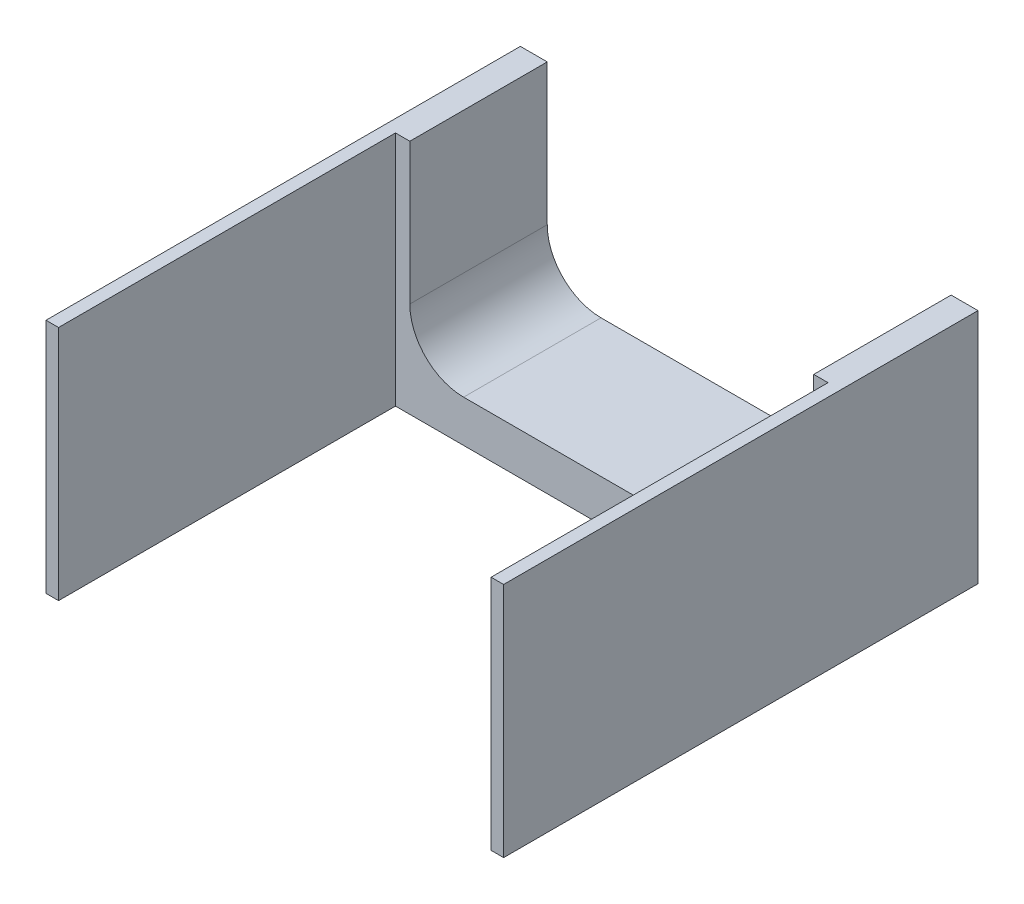
ISO-10303-21;
HEADER;
FILE_DESCRIPTION(('STEP AP214'),'2;1');
FILE_NAME('part.step','',(''),(''),'','','');
FILE_SCHEMA(('AUTOMOTIVE_DESIGN { 1 0 10303 214 1 1 1 1 }'));
ENDSEC;
DATA;
#1=APPLICATION_CONTEXT('core data for automotive mechanical design processes');
#2=APPLICATION_PROTOCOL_DEFINITION('international standard','automotive_design',2000,#1);
#3=PRODUCT_CONTEXT('',#1,'mechanical');
#4=PRODUCT('Part','Part','',(#3));
#5=PRODUCT_RELATED_PRODUCT_CATEGORY('part','',(#4));
#6=PRODUCT_DEFINITION_FORMATION('','',#4);
#7=PRODUCT_DEFINITION_CONTEXT('part definition',#1,'design');
#8=PRODUCT_DEFINITION('design','',#6,#7);
#9=PRODUCT_DEFINITION_SHAPE('','',#8);
#10=(LENGTH_UNIT() NAMED_UNIT(*) SI_UNIT(.MILLI.,.METRE.));
#11=(NAMED_UNIT(*) PLANE_ANGLE_UNIT() SI_UNIT($,.RADIAN.));
#12=(NAMED_UNIT(*) SI_UNIT($,.STERADIAN.) SOLID_ANGLE_UNIT());
#13=UNCERTAINTY_MEASURE_WITH_UNIT(LENGTH_MEASURE(1.E-05),#10,'distance_accuracy_value','');
#14=(GEOMETRIC_REPRESENTATION_CONTEXT(3) GLOBAL_UNCERTAINTY_ASSIGNED_CONTEXT((#13)) GLOBAL_UNIT_ASSIGNED_CONTEXT((#10,
#11,#12)) REPRESENTATION_CONTEXT('',''));
#15=CARTESIAN_POINT('',(0.,0.,0.));
#16=DIRECTION('',(0.,0.,1.));
#17=DIRECTION('',(1.,0.,0.));
#18=AXIS2_PLACEMENT_3D('',#15,#16,#17);
#19=CARTESIAN_POINT('',(18.1,-16.25,39.7));
#20=DIRECTION('',(0.,-1.,0.));
#21=DIRECTION('',(1.,0.,0.));
#22=AXIS2_PLACEMENT_3D('',#19,#20,#21);
#23=PLANE('',#22);
#24=DIRECTION('',(-1.,0.,0.));
#25=VECTOR('',#24,1.);
#26=CARTESIAN_POINT('',(0.,-16.25,39.7));
#27=LINE('',#26,#25);
#28=CARTESIAN_POINT('',(-18.1,-16.25,39.7));
#29=VERTEX_POINT('',#28);
#30=CARTESIAN_POINT('',(-19.15,-16.25,39.7));
#31=VERTEX_POINT('',#30);
#32=EDGE_CURVE('E194',#29,#31,#27,.T.);
#33=ORIENTED_EDGE('',*,*,#32,.T.);
#34=DIRECTION('',(0.,0.,-1.));
#35=VECTOR('',#34,1.);
#36=CARTESIAN_POINT('',(-19.15,-16.25,39.7));
#37=LINE('',#36,#35);
#38=CARTESIAN_POINT('',(-19.15,-16.25,0.));
#39=VERTEX_POINT('',#38);
#40=EDGE_CURVE('E62',#31,#39,#37,.T.);
#41=ORIENTED_EDGE('',*,*,#40,.T.);
#42=DIRECTION('',(-1.,0.,0.));
#43=VECTOR('',#42,1.);
#44=CARTESIAN_POINT('',(-22.25,-16.25,0.));
#45=LINE('',#44,#43);
#46=CARTESIAN_POINT('',(19.15,-16.25,0.));
#47=VERTEX_POINT('',#46);
#48=EDGE_CURVE('E190',#47,#39,#45,.T.);
#49=ORIENTED_EDGE('',*,*,#48,.F.);
#50=DIRECTION('',(0.,0.,-1.));
#51=VECTOR('',#50,1.);
#52=CARTESIAN_POINT('',(19.15,-16.25,39.7));
#53=LINE('',#52,#51);
#54=CARTESIAN_POINT('',(19.15,-16.25,39.7));
#55=VERTEX_POINT('',#54);
#56=EDGE_CURVE('E159',#55,#47,#53,.T.);
#57=ORIENTED_EDGE('',*,*,#56,.F.);
#58=CARTESIAN_POINT('',(18.1,-16.25,39.7));
#59=VERTEX_POINT('',#58);
#60=EDGE_CURVE('E163',#55,#59,#27,.T.);
#61=ORIENTED_EDGE('',*,*,#60,.T.);
#62=DIRECTION('',(0.,0.,-1.));
#63=VECTOR('',#62,1.);
#64=CARTESIAN_POINT('',(18.1,-16.25,39.7));
#65=LINE('',#64,#63);
#66=CARTESIAN_POINT('',(18.1,-16.25,11.5));
#67=VERTEX_POINT('',#66);
#68=EDGE_CURVE('E203',#59,#67,#65,.T.);
#69=ORIENTED_EDGE('',*,*,#68,.T.);
#70=DIRECTION('',(-1.,0.,0.));
#71=VECTOR('',#70,1.);
#72=CARTESIAN_POINT('',(18.1,-16.25,11.5));
#73=LINE('',#72,#71);
#74=CARTESIAN_POINT('',(-18.1,-16.25,11.5));
#75=VERTEX_POINT('',#74);
#76=EDGE_CURVE('E206',#67,#75,#73,.T.);
#77=ORIENTED_EDGE('',*,*,#76,.T.);
#78=DIRECTION('',(0.,0.,-1.));
#79=VECTOR('',#78,1.);
#80=CARTESIAN_POINT('',(-18.1,-16.25,39.7));
#81=LINE('',#80,#79);
#82=EDGE_CURVE('E210',#29,#75,#81,.T.);
#83=ORIENTED_EDGE('',*,*,#82,.F.);
#84=EDGE_LOOP('',(#33,#41,#49,#57,#61,#69,#77,#83));
#85=FACE_BOUND('',#84,.T.);
#86=ADVANCED_FACE('F40',(#85),#23,.T.);
#87=CARTESIAN_POINT('',(0.,0.,39.7));
#88=DIRECTION('',(0.,0.,-1.));
#89=DIRECTION('',(-1.,0.,0.));
#90=AXIS2_PLACEMENT_3D('',#87,#88,#89);
#91=PLANE('',#90);
#92=DIRECTION('',(0.,-1.,0.));
#93=VECTOR('',#92,1.);
#94=CARTESIAN_POINT('',(19.15,3.55000000000002,39.7));
#95=LINE('',#94,#93);
#96=CARTESIAN_POINT('',(19.15,3.55000000000002,39.7));
#97=VERTEX_POINT('',#96);
#98=EDGE_CURVE('E150',#97,#55,#95,.T.);
#99=ORIENTED_EDGE('',*,*,#98,.F.);
#100=DIRECTION('',(1.,0.,0.));
#101=VECTOR('',#100,1.);
#102=CARTESIAN_POINT('',(16.9,3.55000000000002,39.7));
#103=LINE('',#102,#101);
#104=CARTESIAN_POINT('',(18.1,3.55000000000002,39.7));
#105=VERTEX_POINT('',#104);
#106=EDGE_CURVE('E139',#105,#97,#103,.T.);
#107=ORIENTED_EDGE('',*,*,#106,.F.);
#108=DIRECTION('',(0.,-1.,0.));
#109=VECTOR('',#108,1.);
#110=CARTESIAN_POINT('',(18.1,16.25,39.7));
#111=LINE('',#110,#109);
#112=EDGE_CURVE('E197',#105,#59,#111,.T.);
#113=ORIENTED_EDGE('',*,*,#112,.T.);
#114=ORIENTED_EDGE('',*,*,#60,.F.);
#115=EDGE_LOOP('',(#99,#107,#113,#114));
#116=FACE_BOUND('',#115,.T.);
#117=ADVANCED_FACE('F162',(#116),#91,.F.);
#118=CARTESIAN_POINT('',(16.9,-12.75,11.5));
#119=DIRECTION('',(-1.,0.,0.));
#120=DIRECTION('',(0.,0.,1.));
#121=AXIS2_PLACEMENT_3D('',#118,#119,#120);
#122=PLANE('',#121);
#123=DIRECTION('',(0.,1.,0.));
#124=VECTOR('',#123,1.);
#125=CARTESIAN_POINT('',(16.9,-12.75,11.5));
#126=LINE('',#125,#124);
#127=CARTESIAN_POINT('',(16.9,-8.24999999999999,11.5));
#128=VERTEX_POINT('',#127);
#129=CARTESIAN_POINT('',(16.9,3.55000000000002,11.5));
#130=VERTEX_POINT('',#129);
#131=EDGE_CURVE('E222',#128,#130,#126,.T.);
#132=ORIENTED_EDGE('',*,*,#131,.T.);
#133=DIRECTION('',(0.,0.,-1.));
#134=VECTOR('',#133,1.);
#135=CARTESIAN_POINT('',(16.9,3.55000000000002,39.7));
#136=LINE('',#135,#134);
#137=CARTESIAN_POINT('',(16.9,3.55000000000002,0.));
#138=VERTEX_POINT('',#137);
#139=EDGE_CURVE('E54',#130,#138,#136,.T.);
#140=ORIENTED_EDGE('',*,*,#139,.T.);
#141=DIRECTION('',(0.,1.,0.));
#142=VECTOR('',#141,1.);
#143=CARTESIAN_POINT('',(16.9,-12.75,0.));
#144=LINE('',#143,#142);
#145=CARTESIAN_POINT('',(16.9,-8.24999999999999,0.));
#146=VERTEX_POINT('',#145);
#147=EDGE_CURVE('E219',#146,#138,#144,.T.);
#148=ORIENTED_EDGE('',*,*,#147,.F.);
#149=DIRECTION('',(0.,0.,-1.));
#150=VECTOR('',#149,1.);
#151=CARTESIAN_POINT('',(16.9,-8.24999999999999,11.5));
#152=LINE('',#151,#150);
#153=EDGE_CURVE('E225',#146,#128,#152,.F.);
#154=ORIENTED_EDGE('',*,*,#153,.T.);
#155=EDGE_LOOP('',(#132,#140,#148,#154));
#156=FACE_BOUND('',#155,.T.);
#157=ADVANCED_FACE('F298',(#156),#122,.T.);
#158=CARTESIAN_POINT('',(-16.9,-12.75,11.5));
#159=DIRECTION('',(1.,0.,0.));
#160=DIRECTION('',(0.,0.,-1.));
#161=AXIS2_PLACEMENT_3D('',#158,#159,#160);
#162=PLANE('',#161);
#163=DIRECTION('',(0.,-1.,0.));
#164=VECTOR('',#163,1.);
#165=CARTESIAN_POINT('',(-16.9,-12.75,0.));
#166=LINE('',#165,#164);
#167=CARTESIAN_POINT('',(-16.9,3.55000000000002,0.));
#168=VERTEX_POINT('',#167);
#169=CARTESIAN_POINT('',(-16.9,-8.24999999999999,0.));
#170=VERTEX_POINT('',#169);
#171=EDGE_CURVE('E213',#168,#170,#166,.T.);
#172=ORIENTED_EDGE('',*,*,#171,.F.);
#173=DIRECTION('',(0.,0.,-1.));
#174=VECTOR('',#173,1.);
#175=CARTESIAN_POINT('',(-16.9,3.55000000000002,39.7));
#176=LINE('',#175,#174);
#177=CARTESIAN_POINT('',(-16.9,3.55000000000002,11.5));
#178=VERTEX_POINT('',#177);
#179=EDGE_CURVE('E178',#178,#168,#176,.T.);
#180=ORIENTED_EDGE('',*,*,#179,.F.);
#181=DIRECTION('',(0.,-1.,0.));
#182=VECTOR('',#181,1.);
#183=CARTESIAN_POINT('',(-16.9,-12.75,11.5));
#184=LINE('',#183,#182);
#185=CARTESIAN_POINT('',(-16.9,-8.24999999999999,11.5));
#186=VERTEX_POINT('',#185);
#187=EDGE_CURVE('E216',#178,#186,#184,.T.);
#188=ORIENTED_EDGE('',*,*,#187,.T.);
#189=DIRECTION('',(0.,0.,-1.));
#190=VECTOR('',#189,1.);
#191=CARTESIAN_POINT('',(-16.9,-8.24999999999999,0.));
#192=LINE('',#191,#190);
#193=EDGE_CURVE('E233',#186,#170,#192,.T.);
#194=ORIENTED_EDGE('',*,*,#193,.T.);
#195=EDGE_LOOP('',(#172,#180,#188,#194));
#196=FACE_BOUND('',#195,.T.);
#197=ADVANCED_FACE('F259',(#196),#162,.T.);
#198=CARTESIAN_POINT('',(0.,0.,0.));
#199=DIRECTION('',(0.,0.,-1.));
#200=DIRECTION('',(-1.,0.,0.));
#201=AXIS2_PLACEMENT_3D('',#198,#199,#200);
#202=PLANE('',#201);
#203=DIRECTION('',(0.,1.,0.));
#204=VECTOR('',#203,1.);
#205=CARTESIAN_POINT('',(-19.15,-16.25,0.));
#206=LINE('',#205,#204);
#207=CARTESIAN_POINT('',(-19.15,3.55000000000002,0.));
#208=VERTEX_POINT('',#207);
#209=EDGE_CURVE('E173',#39,#208,#206,.T.);
#210=ORIENTED_EDGE('',*,*,#209,.T.);
#211=DIRECTION('',(1.,0.,0.));
#212=VECTOR('',#211,1.);
#213=CARTESIAN_POINT('',(-19.15,3.55000000000002,0.));
#214=LINE('',#213,#212);
#215=EDGE_CURVE('E151',#208,#168,#214,.T.);
#216=ORIENTED_EDGE('',*,*,#215,.T.);
#217=ORIENTED_EDGE('',*,*,#171,.T.);
#218=CARTESIAN_POINT('',(-12.4,-8.24999999999999,0.));
#219=DIRECTION('',(0.,0.,-1.));
#220=DIRECTION('',(-1.,0.,0.));
#221=AXIS2_PLACEMENT_3D('',#218,#219,#220);
#222=CIRCLE('',#221,4.5);
#223=CARTESIAN_POINT('',(-12.4,-12.75,0.));
#224=VERTEX_POINT('',#223);
#225=EDGE_CURVE('E245',#170,#224,#222,.F.);
#226=ORIENTED_EDGE('',*,*,#225,.T.);
#227=DIRECTION('',(1.,0.,0.));
#228=VECTOR('',#227,1.);
#229=CARTESIAN_POINT('',(-16.9,-12.75,0.));
#230=LINE('',#229,#228);
#231=CARTESIAN_POINT('',(12.4,-12.75,0.));
#232=VERTEX_POINT('',#231);
#233=EDGE_CURVE('E227',#224,#232,#230,.T.);
#234=ORIENTED_EDGE('',*,*,#233,.T.);
#235=CARTESIAN_POINT('',(12.4,-8.24999999999999,0.));
#236=DIRECTION('',(0.,0.,-1.));
#237=DIRECTION('',(-1.,0.,0.));
#238=AXIS2_PLACEMENT_3D('',#235,#236,#237);
#239=CIRCLE('',#238,4.5);
#240=EDGE_CURVE('E241',#232,#146,#239,.F.);
#241=ORIENTED_EDGE('',*,*,#240,.T.);
#242=ORIENTED_EDGE('',*,*,#147,.T.);
#243=DIRECTION('',(1.,0.,0.));
#244=VECTOR('',#243,1.);
#245=CARTESIAN_POINT('',(16.9,3.55000000000002,0.));
#246=LINE('',#245,#244);
#247=CARTESIAN_POINT('',(19.15,3.55000000000002,0.));
#248=VERTEX_POINT('',#247);
#249=EDGE_CURVE('E170',#138,#248,#246,.T.);
#250=ORIENTED_EDGE('',*,*,#249,.T.);
#251=DIRECTION('',(0.,-1.,0.));
#252=VECTOR('',#251,1.);
#253=CARTESIAN_POINT('',(19.15,3.55000000000002,0.));
#254=LINE('',#253,#252);
#255=EDGE_CURVE('E157',#248,#47,#254,.T.);
#256=ORIENTED_EDGE('',*,*,#255,.T.);
#257=ORIENTED_EDGE('',*,*,#48,.T.);
#258=EDGE_LOOP('',(#210,#216,#217,#226,#234,#241,#242,#250,#256,#257));
#259=FACE_BOUND('',#258,.T.);
#260=ADVANCED_FACE('F265',(#259),#202,.T.);
#261=CARTESIAN_POINT('',(18.1,16.25,39.7));
#262=DIRECTION('',(1.,0.,0.));
#263=DIRECTION('',(0.,1.,0.));
#264=AXIS2_PLACEMENT_3D('',#261,#262,#263);
#265=PLANE('',#264);
#266=DIRECTION('',(0.,0.,1.));
#267=VECTOR('',#266,1.);
#268=CARTESIAN_POINT('',(18.1,3.55000000000002,39.7));
#269=LINE('',#268,#267);
#270=CARTESIAN_POINT('',(18.1,3.55000000000002,11.5));
#271=VERTEX_POINT('',#270);
#272=EDGE_CURVE('E145',#271,#105,#269,.T.);
#273=ORIENTED_EDGE('',*,*,#272,.F.);
#274=DIRECTION('',(0.,-1.,0.));
#275=VECTOR('',#274,1.);
#276=CARTESIAN_POINT('',(18.1,16.25,11.5));
#277=LINE('',#276,#275);
#278=EDGE_CURVE('E204',#271,#67,#277,.T.);
#279=ORIENTED_EDGE('',*,*,#278,.T.);
#280=ORIENTED_EDGE('',*,*,#68,.F.);
#281=ORIENTED_EDGE('',*,*,#112,.F.);
#282=EDGE_LOOP('',(#273,#279,#280,#281));
#283=FACE_BOUND('',#282,.T.);
#284=ADVANCED_FACE('F282',(#283),#265,.F.);
#285=CARTESIAN_POINT('',(0.,0.,11.5));
#286=DIRECTION('',(0.,0.,-1.));
#287=DIRECTION('',(-1.,0.,0.));
#288=AXIS2_PLACEMENT_3D('',#285,#286,#287);
#289=PLANE('',#288);
#290=DIRECTION('',(1.,0.,0.));
#291=VECTOR('',#290,1.);
#292=CARTESIAN_POINT('',(0.,3.55000000000002,11.5));
#293=LINE('',#292,#291);
#294=CARTESIAN_POINT('',(-18.1,3.55000000000002,11.5));
#295=VERTEX_POINT('',#294);
#296=EDGE_CURVE('E187',#295,#178,#293,.T.);
#297=ORIENTED_EDGE('',*,*,#296,.F.);
#298=DIRECTION('',(0.,1.,0.));
#299=VECTOR('',#298,1.);
#300=CARTESIAN_POINT('',(-18.1,16.25,11.5));
#301=LINE('',#300,#299);
#302=EDGE_CURVE('E200',#75,#295,#301,.T.);
#303=ORIENTED_EDGE('',*,*,#302,.F.);
#304=ORIENTED_EDGE('',*,*,#76,.F.);
#305=ORIENTED_EDGE('',*,*,#278,.F.);
#306=DIRECTION('',(1.,0.,0.));
#307=VECTOR('',#306,1.);
#308=CARTESIAN_POINT('',(0.,3.55000000000002,11.5));
#309=LINE('',#308,#307);
#310=EDGE_CURVE('E13',#130,#271,#309,.T.);
#311=ORIENTED_EDGE('',*,*,#310,.F.);
#312=ORIENTED_EDGE('',*,*,#131,.F.);
#313=CARTESIAN_POINT('',(12.4,-8.24999999999999,11.5));
#314=DIRECTION('',(0.,0.,-1.));
#315=DIRECTION('',(-1.,0.,0.));
#316=AXIS2_PLACEMENT_3D('',#313,#314,#315);
#317=CIRCLE('',#316,4.5);
#318=CARTESIAN_POINT('',(12.4,-12.75,11.5));
#319=VERTEX_POINT('',#318);
#320=EDGE_CURVE('E243',#128,#319,#317,.T.);
#321=ORIENTED_EDGE('',*,*,#320,.T.);
#322=DIRECTION('',(1.,0.,0.));
#323=VECTOR('',#322,1.);
#324=CARTESIAN_POINT('',(-16.9,-12.75,11.5));
#325=LINE('',#324,#323);
#326=CARTESIAN_POINT('',(-12.4,-12.75,11.5));
#327=VERTEX_POINT('',#326);
#328=EDGE_CURVE('E218',#327,#319,#325,.T.);
#329=ORIENTED_EDGE('',*,*,#328,.F.);
#330=CARTESIAN_POINT('',(-12.4,-8.24999999999999,11.5));
#331=DIRECTION('',(0.,0.,-1.));
#332=DIRECTION('',(-1.,0.,0.));
#333=AXIS2_PLACEMENT_3D('',#330,#331,#332);
#334=CIRCLE('',#333,4.5);
#335=EDGE_CURVE('E48',#327,#186,#334,.T.);
#336=ORIENTED_EDGE('',*,*,#335,.T.);
#337=ORIENTED_EDGE('',*,*,#187,.F.);
#338=EDGE_LOOP('',(#297,#303,#304,#305,#311,#312,#321,#329,#336,#337));
#339=FACE_BOUND('',#338,.T.);
#340=ADVANCED_FACE('F253',(#339),#289,.F.);
#341=CARTESIAN_POINT('',(-18.1,16.25,39.7));
#342=DIRECTION('',(-1.,0.,0.));
#343=DIRECTION('',(0.,-1.,0.));
#344=AXIS2_PLACEMENT_3D('',#341,#342,#343);
#345=PLANE('',#344);
#346=DIRECTION('',(0.,0.,-1.));
#347=VECTOR('',#346,1.);
#348=CARTESIAN_POINT('',(-18.1,3.55000000000002,39.7));
#349=LINE('',#348,#347);
#350=CARTESIAN_POINT('',(-18.1,3.55000000000002,39.7));
#351=VERTEX_POINT('',#350);
#352=EDGE_CURVE('E180',#351,#295,#349,.T.);
#353=ORIENTED_EDGE('',*,*,#352,.F.);
#354=DIRECTION('',(0.,1.,0.));
#355=VECTOR('',#354,1.);
#356=CARTESIAN_POINT('',(-18.1,16.25,39.7));
#357=LINE('',#356,#355);
#358=EDGE_CURVE('E199',#29,#351,#357,.T.);
#359=ORIENTED_EDGE('',*,*,#358,.F.);
#360=ORIENTED_EDGE('',*,*,#82,.T.);
#361=ORIENTED_EDGE('',*,*,#302,.T.);
#362=EDGE_LOOP('',(#353,#359,#360,#361));
#363=FACE_BOUND('',#362,.T.);
#364=ADVANCED_FACE('F276',(#363),#345,.F.);
#365=DIRECTION('',(1.,0.,0.));
#366=VECTOR('',#365,1.);
#367=CARTESIAN_POINT('',(-19.15,3.55000000000002,39.7));
#368=LINE('',#367,#366);
#369=CARTESIAN_POINT('',(-19.15,3.55000000000002,39.7));
#370=VERTEX_POINT('',#369);
#371=EDGE_CURVE('E166',#370,#351,#368,.T.);
#372=ORIENTED_EDGE('',*,*,#371,.F.);
#373=DIRECTION('',(0.,1.,0.));
#374=VECTOR('',#373,1.);
#375=CARTESIAN_POINT('',(-19.15,-16.25,39.7));
#376=LINE('',#375,#374);
#377=EDGE_CURVE('E164',#31,#370,#376,.T.);
#378=ORIENTED_EDGE('',*,*,#377,.F.);
#379=ORIENTED_EDGE('',*,*,#32,.F.);
#380=ORIENTED_EDGE('',*,*,#358,.T.);
#381=EDGE_LOOP('',(#372,#378,#379,#380));
#382=FACE_BOUND('',#381,.T.);
#383=ADVANCED_FACE('F273',(#382),#91,.F.);
#384=CARTESIAN_POINT('',(12.4,-8.24999999999999,11.5));
#385=DIRECTION('',(0.,0.,1.));
#386=DIRECTION('',(1.,0.,0.));
#387=AXIS2_PLACEMENT_3D('',#384,#385,#386);
#388=CYLINDRICAL_SURFACE('',#387,4.5);
#389=ORIENTED_EDGE('',*,*,#320,.F.);
#390=ORIENTED_EDGE('',*,*,#153,.F.);
#391=ORIENTED_EDGE('',*,*,#240,.F.);
#392=DIRECTION('',(0.,0.,-1.));
#393=VECTOR('',#392,1.);
#394=CARTESIAN_POINT('',(12.4,-12.75,0.));
#395=LINE('',#394,#393);
#396=EDGE_CURVE('E238',#319,#232,#395,.T.);
#397=ORIENTED_EDGE('',*,*,#396,.F.);
#398=EDGE_LOOP('',(#389,#390,#391,#397));
#399=FACE_BOUND('',#398,.T.);
#400=ADVANCED_FACE('F306',(#399),#388,.F.);
#401=CARTESIAN_POINT('',(-16.9,-12.75,11.5));
#402=DIRECTION('',(0.,1.,0.));
#403=DIRECTION('',(0.,0.,1.));
#404=AXIS2_PLACEMENT_3D('',#401,#402,#403);
#405=PLANE('',#404);
#406=ORIENTED_EDGE('',*,*,#328,.T.);
#407=ORIENTED_EDGE('',*,*,#396,.T.);
#408=ORIENTED_EDGE('',*,*,#233,.F.);
#409=DIRECTION('',(0.,0.,-1.));
#410=VECTOR('',#409,1.);
#411=CARTESIAN_POINT('',(-12.4,-12.75,11.5));
#412=LINE('',#411,#410);
#413=EDGE_CURVE('E236',#224,#327,#412,.F.);
#414=ORIENTED_EDGE('',*,*,#413,.T.);
#415=EDGE_LOOP('',(#406,#407,#408,#414));
#416=FACE_BOUND('',#415,.T.);
#417=ADVANCED_FACE('F310',(#416),#405,.T.);
#418=CARTESIAN_POINT('',(-12.4,-8.24999999999999,11.5));
#419=DIRECTION('',(0.,0.,1.));
#420=DIRECTION('',(1.,0.,0.));
#421=AXIS2_PLACEMENT_3D('',#418,#419,#420);
#422=CYLINDRICAL_SURFACE('',#421,4.5);
#423=ORIENTED_EDGE('',*,*,#335,.F.);
#424=ORIENTED_EDGE('',*,*,#413,.F.);
#425=ORIENTED_EDGE('',*,*,#225,.F.);
#426=ORIENTED_EDGE('',*,*,#193,.F.);
#427=EDGE_LOOP('',(#423,#424,#425,#426));
#428=FACE_BOUND('',#427,.T.);
#429=ADVANCED_FACE('F42',(#428),#422,.F.);
#430=CARTESIAN_POINT('',(-19.15,-16.25,39.7));
#431=DIRECTION('',(-1.,0.,0.));
#432=DIRECTION('',(0.,-1.,0.));
#433=AXIS2_PLACEMENT_3D('',#430,#431,#432);
#434=PLANE('',#433);
#435=ORIENTED_EDGE('',*,*,#209,.F.);
#436=ORIENTED_EDGE('',*,*,#40,.F.);
#437=ORIENTED_EDGE('',*,*,#377,.T.);
#438=DIRECTION('',(0.,0.,-1.));
#439=VECTOR('',#438,1.);
#440=CARTESIAN_POINT('',(-19.15,3.55000000000002,39.7));
#441=LINE('',#440,#439);
#442=EDGE_CURVE('E181',#370,#208,#441,.T.);
#443=ORIENTED_EDGE('',*,*,#442,.T.);
#444=EDGE_LOOP('',(#435,#436,#437,#443));
#445=FACE_BOUND('',#444,.T.);
#446=ADVANCED_FACE('F267',(#445),#434,.T.);
#447=CARTESIAN_POINT('',(-19.15,3.55000000000002,39.7));
#448=DIRECTION('',(0.,1.,0.));
#449=DIRECTION('',(0.,0.,1.));
#450=AXIS2_PLACEMENT_3D('',#447,#448,#449);
#451=PLANE('',#450);
#452=ORIENTED_EDGE('',*,*,#296,.T.);
#453=ORIENTED_EDGE('',*,*,#179,.T.);
#454=ORIENTED_EDGE('',*,*,#215,.F.);
#455=ORIENTED_EDGE('',*,*,#442,.F.);
#456=ORIENTED_EDGE('',*,*,#371,.T.);
#457=ORIENTED_EDGE('',*,*,#352,.T.);
#458=EDGE_LOOP('',(#452,#453,#454,#455,#456,#457));
#459=FACE_BOUND('',#458,.T.);
#460=ADVANCED_FACE('F263',(#459),#451,.T.);
#461=CARTESIAN_POINT('',(16.9,3.55000000000002,39.7));
#462=DIRECTION('',(0.,1.,0.));
#463=DIRECTION('',(-1.,0.,0.));
#464=AXIS2_PLACEMENT_3D('',#461,#462,#463);
#465=PLANE('',#464);
#466=ORIENTED_EDGE('',*,*,#272,.T.);
#467=ORIENTED_EDGE('',*,*,#106,.T.);
#468=DIRECTION('',(0.,0.,-1.));
#469=VECTOR('',#468,1.);
#470=CARTESIAN_POINT('',(19.15,3.55000000000002,39.7));
#471=LINE('',#470,#469);
#472=EDGE_CURVE('E142',#97,#248,#471,.T.);
#473=ORIENTED_EDGE('',*,*,#472,.T.);
#474=ORIENTED_EDGE('',*,*,#249,.F.);
#475=ORIENTED_EDGE('',*,*,#139,.F.);
#476=ORIENTED_EDGE('',*,*,#310,.T.);
#477=EDGE_LOOP('',(#466,#467,#473,#474,#475,#476));
#478=FACE_BOUND('',#477,.T.);
#479=ADVANCED_FACE('F141',(#478),#465,.T.);
#480=CARTESIAN_POINT('',(19.15,3.55000000000002,39.7));
#481=DIRECTION('',(1.,0.,0.));
#482=DIRECTION('',(0.,1.,0.));
#483=AXIS2_PLACEMENT_3D('',#480,#481,#482);
#484=PLANE('',#483);
#485=ORIENTED_EDGE('',*,*,#255,.F.);
#486=ORIENTED_EDGE('',*,*,#472,.F.);
#487=ORIENTED_EDGE('',*,*,#98,.T.);
#488=ORIENTED_EDGE('',*,*,#56,.T.);
#489=EDGE_LOOP('',(#485,#486,#487,#488));
#490=FACE_BOUND('',#489,.T.);
#491=ADVANCED_FACE('F154',(#490),#484,.T.);
#492=CLOSED_SHELL('',(#86,#117,#157,#197,#260,#284,#340,#364,#383,#400,#417,#429,#446,#460,#479,#491));
#493=MANIFOLD_SOLID_BREP('B2',#492);
#494=ADVANCED_BREP_SHAPE_REPRESENTATION('',(#18,#493),#14);
#495=SHAPE_DEFINITION_REPRESENTATION(#9,#494);
ENDSEC;
END-ISO-10303-21;
